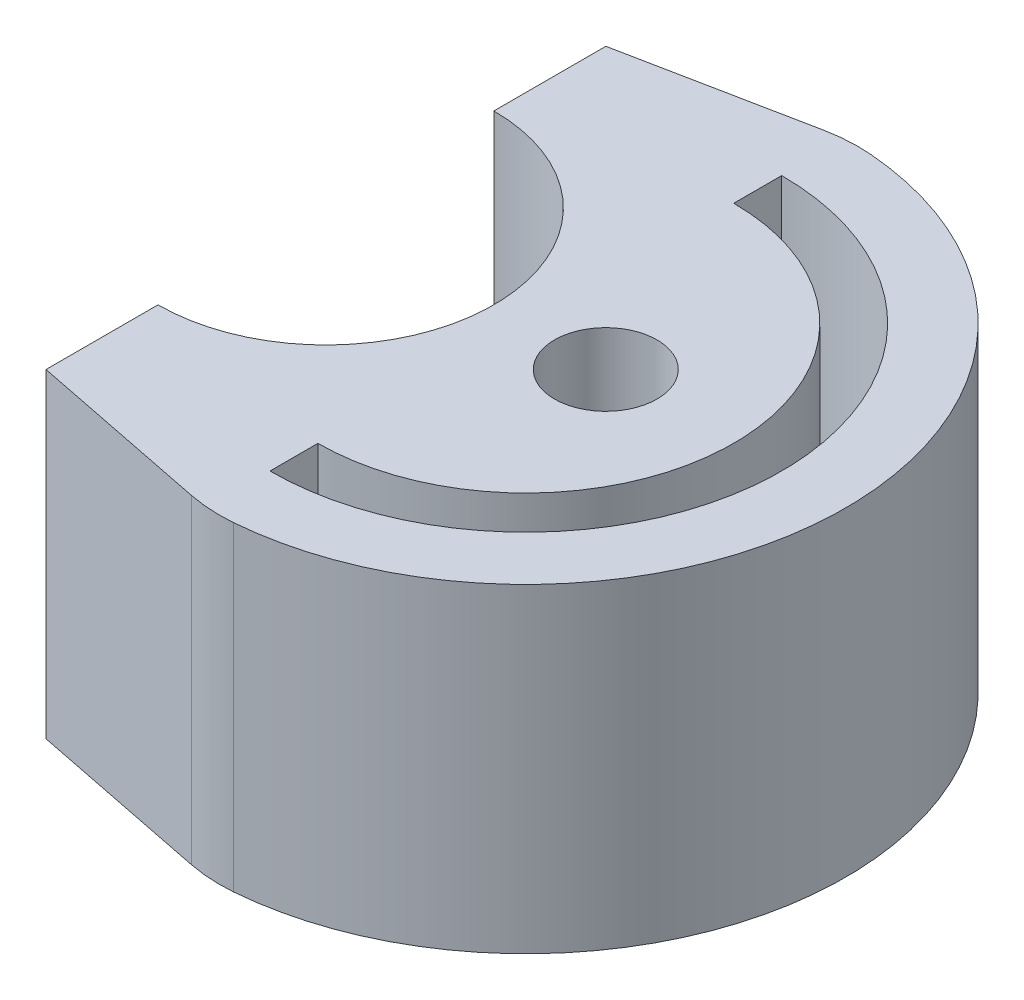
ISO-10303-21;
HEADER;
FILE_DESCRIPTION(('STEP AP214'),'2;1');
FILE_NAME('part.step','',(''),(''),'','','');
FILE_SCHEMA(('AUTOMOTIVE_DESIGN { 1 0 10303 214 1 1 1 1 }'));
ENDSEC;
DATA;
#1=APPLICATION_CONTEXT('core data for automotive mechanical design processes');
#2=APPLICATION_PROTOCOL_DEFINITION('international standard','automotive_design',2000,#1);
#3=PRODUCT_CONTEXT('',#1,'mechanical');
#4=PRODUCT('Part','Part','',(#3));
#5=PRODUCT_RELATED_PRODUCT_CATEGORY('part','',(#4));
#6=PRODUCT_DEFINITION_FORMATION('','',#4);
#7=PRODUCT_DEFINITION_CONTEXT('part definition',#1,'design');
#8=PRODUCT_DEFINITION('design','',#6,#7);
#9=PRODUCT_DEFINITION_SHAPE('','',#8);
#10=(LENGTH_UNIT() NAMED_UNIT(*) SI_UNIT(.MILLI.,.METRE.));
#11=(NAMED_UNIT(*) PLANE_ANGLE_UNIT() SI_UNIT($,.RADIAN.));
#12=(NAMED_UNIT(*) SI_UNIT($,.STERADIAN.) SOLID_ANGLE_UNIT());
#13=UNCERTAINTY_MEASURE_WITH_UNIT(LENGTH_MEASURE(1.E-05),#10,'distance_accuracy_value','');
#14=(GEOMETRIC_REPRESENTATION_CONTEXT(3) GLOBAL_UNCERTAINTY_ASSIGNED_CONTEXT((#13)) GLOBAL_UNIT_ASSIGNED_CONTEXT((#10,
#11,#12)) REPRESENTATION_CONTEXT('',''));
#15=CARTESIAN_POINT('',(0.,0.,0.));
#16=DIRECTION('',(0.,0.,1.));
#17=DIRECTION('',(1.,0.,0.));
#18=AXIS2_PLACEMENT_3D('',#15,#16,#17);
#19=CARTESIAN_POINT('',(-1.05819487287301E-11,0.5,-1.28546370596616E-10));
#20=DIRECTION('',(0.,-1.,0.));
#21=DIRECTION('',(0.,0.,-1.));
#22=AXIS2_PLACEMENT_3D('',#19,#20,#21);
#23=CYLINDRICAL_SURFACE('',#22,2.00000000012898);
#24=CARTESIAN_POINT('',(-1.05819487287301E-11,0.,-1.28546370596616E-10));
#25=DIRECTION('',(0.,1.,0.));
#26=DIRECTION('',(0.,0.,1.));
#27=AXIS2_PLACEMENT_3D('',#24,#25,#26);
#28=CIRCLE('',#27,2.00000000012898);
#29=CARTESIAN_POINT('',(0.164100899999999,0.,-1.99325635472312));
#30=VERTEX_POINT('',#29);
#31=CARTESIAN_POINT('',(0.164100898177525,0.,1.99325635461607));
#32=VERTEX_POINT('',#31);
#33=EDGE_CURVE('E118',#30,#32,#28,.F.);
#34=ORIENTED_EDGE('',*,*,#33,.F.);
#35=DIRECTION('',(0.,-1.,0.));
#36=VECTOR('',#35,1.);
#37=CARTESIAN_POINT('',(0.164100899999999,0.5,-1.99325635472312));
#38=LINE('',#37,#36);
#39=CARTESIAN_POINT('',(0.164100899999999,2.,-1.99325635472312));
#40=VERTEX_POINT('',#39);
#41=EDGE_CURVE('E11',#40,#30,#38,.T.);
#42=ORIENTED_EDGE('',*,*,#41,.F.);
#43=CARTESIAN_POINT('',(-1.05819487287301E-11,2.,-1.28546370596616E-10));
#44=DIRECTION('',(0.,1.,0.));
#45=DIRECTION('',(0.,0.,1.));
#46=AXIS2_PLACEMENT_3D('',#43,#44,#45);
#47=CIRCLE('',#46,2.00000000012898);
#48=CARTESIAN_POINT('',(0.164100898177525,2.,1.99325635461607));
#49=VERTEX_POINT('',#48);
#50=EDGE_CURVE('E209',#40,#49,#47,.F.);
#51=ORIENTED_EDGE('',*,*,#50,.T.);
#52=DIRECTION('',(0.,-1.,0.));
#53=VECTOR('',#52,1.);
#54=CARTESIAN_POINT('',(0.164100898177525,0.5,1.99325635461607));
#55=LINE('',#54,#53);
#56=EDGE_CURVE('E109',#49,#32,#55,.T.);
#57=ORIENTED_EDGE('',*,*,#56,.T.);
#58=EDGE_LOOP('',(#34,#42,#51,#57));
#59=FACE_BOUND('',#58,.T.);
#60=ADVANCED_FACE('F36',(#59),#23,.T.);
#61=CARTESIAN_POINT('',(0.0820504499999999,0.5,-0.996628177490106));
#62=DIRECTION('',(0.,-1.,0.));
#63=DIRECTION('',(0.,0.,-1.));
#64=AXIS2_PLACEMENT_3D('',#61,#62,#63);
#65=CYLINDRICAL_SURFACE('',#64,1.);
#66=CARTESIAN_POINT('',(0.0820504499999999,0.,-0.996628177490106));
#67=DIRECTION('',(0.,1.,0.));
#68=DIRECTION('',(0.,0.,1.));
#69=AXIS2_PLACEMENT_3D('',#66,#67,#68);
#70=CIRCLE('',#69,1.);
#71=CARTESIAN_POINT('',(-0.113883759060197,0.,-1.97724522084595));
#72=VERTEX_POINT('',#71);
#73=EDGE_CURVE('E174',#30,#72,#70,.T.);
#74=ORIENTED_EDGE('',*,*,#73,.T.);
#75=DIRECTION('',(0.,-1.,0.));
#76=VECTOR('',#75,1.);
#77=CARTESIAN_POINT('',(-0.113883759060197,0.5,-1.97724522084595));
#78=LINE('',#77,#76);
#79=CARTESIAN_POINT('',(-0.113883759060197,2.,-1.97724522084595));
#80=VERTEX_POINT('',#79);
#81=EDGE_CURVE('E46',#80,#72,#78,.T.);
#82=ORIENTED_EDGE('',*,*,#81,.F.);
#83=CARTESIAN_POINT('',(0.0820504499999999,2.,-0.996628177490106));
#84=DIRECTION('',(0.,1.,0.));
#85=DIRECTION('',(0.,0.,1.));
#86=AXIS2_PLACEMENT_3D('',#83,#84,#85);
#87=CIRCLE('',#86,1.);
#88=EDGE_CURVE('E219',#40,#80,#87,.T.);
#89=ORIENTED_EDGE('',*,*,#88,.F.);
#90=ORIENTED_EDGE('',*,*,#41,.T.);
#91=EDGE_LOOP('',(#74,#82,#89,#90));
#92=FACE_BOUND('',#91,.T.);
#93=ADVANCED_FACE('F294',(#92),#65,.T.);
#94=CARTESIAN_POINT('',(-0.384272849561752,0.5,-1.92321957143991));
#95=DIRECTION('',(0.195934209060197,0.,0.980617043355843));
#96=DIRECTION('',(0.980617043355843,0.,-0.195934209060197));
#97=AXIS2_PLACEMENT_3D('',#94,#95,#96);
#98=PLANE('',#97);
#99=DIRECTION('',(-0.980617043355843,0.,0.195934209060197));
#100=VECTOR('',#99,1.);
#101=CARTESIAN_POINT('',(-0.384272849561752,0.,-1.92321957143991));
#102=LINE('',#101,#100);
#103=CARTESIAN_POINT('',(-1.24999999999968,0.,-1.7502411741825));
#104=VERTEX_POINT('',#103);
#105=EDGE_CURVE('E177',#72,#104,#102,.T.);
#106=ORIENTED_EDGE('',*,*,#105,.T.);
#107=DIRECTION('',(0.,-1.,0.));
#108=VECTOR('',#107,1.);
#109=CARTESIAN_POINT('',(-1.24999999999968,0.5,-1.7502411741825));
#110=LINE('',#109,#108);
#111=CARTESIAN_POINT('',(-1.24999999999968,2.,-1.7502411741825));
#112=VERTEX_POINT('',#111);
#113=EDGE_CURVE('E134',#112,#104,#110,.T.);
#114=ORIENTED_EDGE('',*,*,#113,.F.);
#115=DIRECTION('',(-0.980617043355843,0.,0.195934209060197));
#116=VECTOR('',#115,1.);
#117=CARTESIAN_POINT('',(-0.384272849561752,2.,-1.92321957143991));
#118=LINE('',#117,#116);
#119=EDGE_CURVE('E226',#80,#112,#118,.T.);
#120=ORIENTED_EDGE('',*,*,#119,.F.);
#121=ORIENTED_EDGE('',*,*,#81,.T.);
#122=EDGE_LOOP('',(#106,#114,#120,#121));
#123=FACE_BOUND('',#122,.T.);
#124=ADVANCED_FACE('F199',(#123),#98,.F.);
#125=CARTESIAN_POINT('',(-1.24999999999968,0.5,0.));
#126=DIRECTION('',(-1.,0.,0.));
#127=DIRECTION('',(0.,0.,1.));
#128=AXIS2_PLACEMENT_3D('',#125,#126,#127);
#129=PLANE('',#128);
#130=DIRECTION('',(0.,0.,-1.));
#131=VECTOR('',#130,1.);
#132=CARTESIAN_POINT('',(-1.24999999999968,0.,0.));
#133=LINE('',#132,#131);
#134=CARTESIAN_POINT('',(-1.24999999999968,0.,-1.2499999999997));
#135=VERTEX_POINT('',#134);
#136=EDGE_CURVE('E180',#135,#104,#133,.T.);
#137=ORIENTED_EDGE('',*,*,#136,.F.);
#138=DIRECTION('',(0.,-1.,0.));
#139=VECTOR('',#138,1.);
#140=CARTESIAN_POINT('',(-1.24999999999968,0.5,-1.2499999999997));
#141=LINE('',#140,#139);
#142=CARTESIAN_POINT('',(-1.24999999999968,0.5,-1.2499999999997));
#143=VERTEX_POINT('',#142);
#144=EDGE_CURVE('E136',#143,#135,#141,.T.);
#145=ORIENTED_EDGE('',*,*,#144,.F.);
#146=DIRECTION('',(0.,0.,1.));
#147=VECTOR('',#146,1.);
#148=CARTESIAN_POINT('',(-1.24999999999968,0.5,0.));
#149=LINE('',#148,#147);
#150=CARTESIAN_POINT('',(-1.24999999999968,0.5,-1.0499999999997));
#151=VERTEX_POINT('',#150);
#152=EDGE_CURVE('E54',#143,#151,#149,.T.);
#153=ORIENTED_EDGE('',*,*,#152,.T.);
#154=DIRECTION('',(0.,-1.,0.));
#155=VECTOR('',#154,1.);
#156=CARTESIAN_POINT('',(-1.24999999999968,2.,-1.0499999999997));
#157=LINE('',#156,#155);
#158=CARTESIAN_POINT('',(-1.24999999999968,2.,-1.0499999999997));
#159=VERTEX_POINT('',#158);
#160=EDGE_CURVE('E244',#159,#151,#157,.T.);
#161=ORIENTED_EDGE('',*,*,#160,.F.);
#162=DIRECTION('',(0.,0.,1.));
#163=VECTOR('',#162,1.);
#164=CARTESIAN_POINT('',(-1.24999999999968,2.,0.));
#165=LINE('',#164,#163);
#166=EDGE_CURVE('E195',#112,#159,#165,.T.);
#167=ORIENTED_EDGE('',*,*,#166,.F.);
#168=ORIENTED_EDGE('',*,*,#113,.T.);
#169=EDGE_LOOP('',(#137,#145,#153,#161,#167,#168));
#170=FACE_BOUND('',#169,.T.);
#171=ADVANCED_FACE('F189',(#170),#129,.T.);
#172=CARTESIAN_POINT('',(-1.24999999999968,0.5,0.));
#173=DIRECTION('',(0.,-1.,0.));
#174=DIRECTION('',(0.,0.,-1.));
#175=AXIS2_PLACEMENT_3D('',#172,#173,#174);
#176=CYLINDRICAL_SURFACE('',#175,1.24999999999969);
#177=CARTESIAN_POINT('',(-1.24999999999968,0.,0.));
#178=DIRECTION('',(0.,1.,0.));
#179=DIRECTION('',(0.,0.,1.));
#180=AXIS2_PLACEMENT_3D('',#177,#178,#179);
#181=CIRCLE('',#180,1.24999999999969);
#182=CARTESIAN_POINT('',(-1.24999999999968,0.,1.24999999999969));
#183=VERTEX_POINT('',#182);
#184=EDGE_CURVE('E126',#183,#135,#181,.T.);
#185=ORIENTED_EDGE('',*,*,#184,.F.);
#186=DIRECTION('',(0.,-1.,0.));
#187=VECTOR('',#186,1.);
#188=CARTESIAN_POINT('',(-1.24999999999968,0.5,1.24999999999969));
#189=LINE('',#188,#187);
#190=CARTESIAN_POINT('',(-1.24999999999968,0.5,1.24999999999969));
#191=VERTEX_POINT('',#190);
#192=EDGE_CURVE('E133',#191,#183,#189,.T.);
#193=ORIENTED_EDGE('',*,*,#192,.F.);
#194=CARTESIAN_POINT('',(-1.24999999999968,0.5,0.));
#195=DIRECTION('',(0.,1.,0.));
#196=DIRECTION('',(0.,0.,1.));
#197=AXIS2_PLACEMENT_3D('',#194,#195,#196);
#198=CIRCLE('',#197,1.24999999999969);
#199=EDGE_CURVE('E119',#191,#143,#198,.T.);
#200=ORIENTED_EDGE('',*,*,#199,.T.);
#201=ORIENTED_EDGE('',*,*,#144,.T.);
#202=EDGE_LOOP('',(#185,#193,#200,#201));
#203=FACE_BOUND('',#202,.T.);
#204=ADVANCED_FACE('F187',(#203),#176,.F.);
#205=CARTESIAN_POINT('',(-1.24999999999968,0.5,0.));
#206=DIRECTION('',(1.,0.,0.));
#207=DIRECTION('',(0.,0.,-1.));
#208=AXIS2_PLACEMENT_3D('',#205,#206,#207);
#209=PLANE('',#208);
#210=DIRECTION('',(0.,0.,1.));
#211=VECTOR('',#210,1.);
#212=CARTESIAN_POINT('',(-1.24999999999968,0.,0.));
#213=LINE('',#212,#211);
#214=CARTESIAN_POINT('',(-1.24999999999968,0.,1.7502411741825));
#215=VERTEX_POINT('',#214);
#216=EDGE_CURVE('E124',#183,#215,#213,.T.);
#217=ORIENTED_EDGE('',*,*,#216,.T.);
#218=DIRECTION('',(0.,-1.,0.));
#219=VECTOR('',#218,1.);
#220=CARTESIAN_POINT('',(-1.24999999999968,0.5,1.7502411741825));
#221=LINE('',#220,#219);
#222=CARTESIAN_POINT('',(-1.24999999999968,2.,1.7502411741825));
#223=VERTEX_POINT('',#222);
#224=EDGE_CURVE('E108',#223,#215,#221,.T.);
#225=ORIENTED_EDGE('',*,*,#224,.F.);
#226=DIRECTION('',(0.,0.,-1.));
#227=VECTOR('',#226,1.);
#228=CARTESIAN_POINT('',(-1.24999999999968,2.,0.));
#229=LINE('',#228,#227);
#230=CARTESIAN_POINT('',(-1.24999999999968,2.,1.04999999999969));
#231=VERTEX_POINT('',#230);
#232=EDGE_CURVE('E221',#223,#231,#229,.T.);
#233=ORIENTED_EDGE('',*,*,#232,.T.);
#234=DIRECTION('',(0.,-1.,0.));
#235=VECTOR('',#234,1.);
#236=CARTESIAN_POINT('',(-1.24999999999968,2.,1.04999999999969));
#237=LINE('',#236,#235);
#238=CARTESIAN_POINT('',(-1.24999999999968,0.5,1.04999999999969));
#239=VERTEX_POINT('',#238);
#240=EDGE_CURVE('E161',#231,#239,#237,.T.);
#241=ORIENTED_EDGE('',*,*,#240,.T.);
#242=DIRECTION('',(0.,0.,-1.));
#243=VECTOR('',#242,1.);
#244=CARTESIAN_POINT('',(-1.24999999999968,0.5,0.));
#245=LINE('',#244,#243);
#246=EDGE_CURVE('E154',#191,#239,#245,.T.);
#247=ORIENTED_EDGE('',*,*,#246,.F.);
#248=ORIENTED_EDGE('',*,*,#192,.T.);
#249=EDGE_LOOP('',(#217,#225,#233,#241,#247,#248));
#250=FACE_BOUND('',#249,.T.);
#251=ADVANCED_FACE('F269',(#250),#209,.F.);
#252=CARTESIAN_POINT('',(-0.384272849561752,0.5,1.92321957143991));
#253=DIRECTION('',(-0.195934209060197,0.,0.980617043355843));
#254=DIRECTION('',(0.980617043355843,0.,0.195934209060197));
#255=AXIS2_PLACEMENT_3D('',#252,#253,#254);
#256=PLANE('',#255);
#257=DIRECTION('',(-0.980617043355843,0.,-0.195934209060197));
#258=VECTOR('',#257,1.);
#259=CARTESIAN_POINT('',(-0.384272849561752,0.,1.92321957143991));
#260=LINE('',#259,#258);
#261=CARTESIAN_POINT('',(-0.113883759971435,0.,1.97724522066388));
#262=VERTEX_POINT('',#261);
#263=EDGE_CURVE('E115',#262,#215,#260,.T.);
#264=ORIENTED_EDGE('',*,*,#263,.F.);
#265=DIRECTION('',(0.,-1.,0.));
#266=VECTOR('',#265,1.);
#267=CARTESIAN_POINT('',(-0.113883759971435,0.5,1.97724522066388));
#268=LINE('',#267,#266);
#269=CARTESIAN_POINT('',(-0.113883759971435,2.,1.97724522066388));
#270=VERTEX_POINT('',#269);
#271=EDGE_CURVE('E95',#270,#262,#268,.T.);
#272=ORIENTED_EDGE('',*,*,#271,.F.);
#273=DIRECTION('',(-0.980617043355843,0.,-0.195934209060197));
#274=VECTOR('',#273,1.);
#275=CARTESIAN_POINT('',(-0.384272849561752,2.,1.92321957143991));
#276=LINE('',#275,#274);
#277=EDGE_CURVE('E217',#270,#223,#276,.T.);
#278=ORIENTED_EDGE('',*,*,#277,.T.);
#279=ORIENTED_EDGE('',*,*,#224,.T.);
#280=EDGE_LOOP('',(#264,#272,#278,#279));
#281=FACE_BOUND('',#280,.T.);
#282=ADVANCED_FACE('F121',(#281),#256,.T.);
#283=CARTESIAN_POINT('',(-1.05819487287301E-11,0.5,-1.28546370596616E-10));
#284=DIRECTION('',(0.,-1.,0.));
#285=DIRECTION('',(0.,0.,-1.));
#286=AXIS2_PLACEMENT_3D('',#283,#284,#285);
#287=CYLINDRICAL_SURFACE('',#286,1.3);
#288=CARTESIAN_POINT('',(-1.05819487287301E-11,0.,-1.28546370596616E-10));
#289=DIRECTION('',(0.,1.,0.));
#290=DIRECTION('',(0.,0.,1.));
#291=AXIS2_PLACEMENT_3D('',#288,#289,#290);
#292=CIRCLE('',#291,1.3);
#293=CARTESIAN_POINT('',(-1.0582065822565E-11,0.,-1.30000000012855));
#294=VERTEX_POINT('',#293);
#295=CARTESIAN_POINT('',(-1.0582065822565E-11,0.,1.29999999987145));
#296=VERTEX_POINT('',#295);
#297=EDGE_CURVE('E157',#294,#296,#292,.F.);
#298=ORIENTED_EDGE('',*,*,#297,.F.);
#299=DIRECTION('',(0.,-1.,0.));
#300=VECTOR('',#299,1.);
#301=CARTESIAN_POINT('',(-1.0582065822565E-11,0.5,-1.30000000012855));
#302=LINE('',#301,#300);
#303=CARTESIAN_POINT('',(-1.0582065822565E-11,2.,-1.30000000012855));
#304=VERTEX_POINT('',#303);
#305=EDGE_CURVE('E130',#304,#294,#302,.T.);
#306=ORIENTED_EDGE('',*,*,#305,.F.);
#307=CARTESIAN_POINT('',(-1.05819487287301E-11,2.,-1.28546370596616E-10));
#308=DIRECTION('',(0.,1.,0.));
#309=DIRECTION('',(0.,0.,1.));
#310=AXIS2_PLACEMENT_3D('',#307,#308,#309);
#311=CIRCLE('',#310,1.3);
#312=CARTESIAN_POINT('',(-1.0582065822565E-11,2.,1.29999999987145));
#313=VERTEX_POINT('',#312);
#314=EDGE_CURVE('E229',#304,#313,#311,.F.);
#315=ORIENTED_EDGE('',*,*,#314,.T.);
#316=DIRECTION('',(0.,-1.,0.));
#317=VECTOR('',#316,1.);
#318=CARTESIAN_POINT('',(-1.0582065822565E-11,0.5,1.29999999987145));
#319=LINE('',#318,#317);
#320=EDGE_CURVE('E139',#313,#296,#319,.T.);
#321=ORIENTED_EDGE('',*,*,#320,.T.);
#322=EDGE_LOOP('',(#298,#306,#315,#321));
#323=FACE_BOUND('',#322,.T.);
#324=ADVANCED_FACE('F38',(#323),#287,.T.);
#325=CARTESIAN_POINT('',(-1.05825008262379E-11,0.5,0.));
#326=DIRECTION('',(1.,0.,0.));
#327=DIRECTION('',(0.,0.,-1.));
#328=AXIS2_PLACEMENT_3D('',#325,#326,#327);
#329=PLANE('',#328);
#330=DIRECTION('',(0.,0.,1.));
#331=VECTOR('',#330,1.);
#332=CARTESIAN_POINT('',(-1.05825008262379E-11,0.,0.));
#333=LINE('',#332,#331);
#334=CARTESIAN_POINT('',(-1.05819654371021E-11,0.,-1.60000000012855));
#335=VERTEX_POINT('',#334);
#336=EDGE_CURVE('E160',#335,#294,#333,.T.);
#337=ORIENTED_EDGE('',*,*,#336,.F.);
#338=DIRECTION('',(0.,-1.,0.));
#339=VECTOR('',#338,1.);
#340=CARTESIAN_POINT('',(-1.05819654371021E-11,0.5,-1.60000000012855));
#341=LINE('',#340,#339);
#342=CARTESIAN_POINT('',(-1.05819654371021E-11,2.,-1.60000000012855));
#343=VERTEX_POINT('',#342);
#344=EDGE_CURVE('E143',#343,#335,#341,.T.);
#345=ORIENTED_EDGE('',*,*,#344,.F.);
#346=DIRECTION('',(0.,0.,1.));
#347=VECTOR('',#346,1.);
#348=CARTESIAN_POINT('',(-1.05825008262379E-11,2.,0.));
#349=LINE('',#348,#347);
#350=EDGE_CURVE('E232',#343,#304,#349,.T.);
#351=ORIENTED_EDGE('',*,*,#350,.T.);
#352=ORIENTED_EDGE('',*,*,#305,.T.);
#353=EDGE_LOOP('',(#337,#345,#351,#352));
#354=FACE_BOUND('',#353,.T.);
#355=ADVANCED_FACE('F314',(#354),#329,.T.);
#356=CARTESIAN_POINT('',(-1.05819487287301E-11,0.5,-1.28546370596616E-10));
#357=DIRECTION('',(0.,-1.,0.));
#358=DIRECTION('',(0.,0.,-1.));
#359=AXIS2_PLACEMENT_3D('',#356,#357,#358);
#360=CYLINDRICAL_SURFACE('',#359,1.6);
#361=CARTESIAN_POINT('',(-1.05819487287301E-11,0.,-1.28546370596616E-10));
#362=DIRECTION('',(0.,1.,0.));
#363=DIRECTION('',(0.,0.,1.));
#364=AXIS2_PLACEMENT_3D('',#361,#362,#363);
#365=CIRCLE('',#364,1.6);
#366=CARTESIAN_POINT('',(-1.05819654371021E-11,0.,1.59999999987145));
#367=VERTEX_POINT('',#366);
#368=EDGE_CURVE('E164',#335,#367,#365,.F.);
#369=ORIENTED_EDGE('',*,*,#368,.T.);
#370=DIRECTION('',(0.,-1.,0.));
#371=VECTOR('',#370,1.);
#372=CARTESIAN_POINT('',(-1.05819654371021E-11,0.5,1.59999999987145));
#373=LINE('',#372,#371);
#374=CARTESIAN_POINT('',(-1.05819654371021E-11,2.,1.59999999987145));
#375=VERTEX_POINT('',#374);
#376=EDGE_CURVE('E141',#375,#367,#373,.T.);
#377=ORIENTED_EDGE('',*,*,#376,.F.);
#378=CARTESIAN_POINT('',(-1.05819487287301E-11,2.,-1.28546370596616E-10));
#379=DIRECTION('',(0.,1.,0.));
#380=DIRECTION('',(0.,0.,1.));
#381=AXIS2_PLACEMENT_3D('',#378,#379,#380);
#382=CIRCLE('',#381,1.6);
#383=EDGE_CURVE('E235',#343,#375,#382,.F.);
#384=ORIENTED_EDGE('',*,*,#383,.F.);
#385=ORIENTED_EDGE('',*,*,#344,.T.);
#386=EDGE_LOOP('',(#369,#377,#384,#385));
#387=FACE_BOUND('',#386,.T.);
#388=ADVANCED_FACE('F309',(#387),#360,.F.);
#389=CARTESIAN_POINT('',(0.5,0.5,0.));
#390=DIRECTION('',(0.,-1.,0.));
#391=DIRECTION('',(0.,0.,-1.));
#392=AXIS2_PLACEMENT_3D('',#389,#390,#391);
#393=CYLINDRICAL_SURFACE('',#392,0.3207);
#394=CARTESIAN_POINT('',(0.5,0.,0.));
#395=DIRECTION('',(0.,1.,0.));
#396=DIRECTION('',(0.,0.,1.));
#397=AXIS2_PLACEMENT_3D('',#394,#395,#396);
#398=CIRCLE('',#397,0.3207);
#399=CARTESIAN_POINT('',(0.5,0.,0.3207));
#400=VERTEX_POINT('',#399);
#401=EDGE_CURVE('E170',#400,#400,#398,.T.);
#402=ORIENTED_EDGE('',*,*,#401,.F.);
#403=EDGE_LOOP('',(#402));
#404=FACE_BOUND('',#403,.T.);
#405=CARTESIAN_POINT('',(0.5,2.,0.));
#406=DIRECTION('',(0.,1.,0.));
#407=DIRECTION('',(0.,0.,1.));
#408=AXIS2_PLACEMENT_3D('',#405,#406,#407);
#409=CIRCLE('',#408,0.3207);
#410=CARTESIAN_POINT('',(0.5,2.,0.3207));
#411=VERTEX_POINT('',#410);
#412=EDGE_CURVE('E241',#411,#411,#409,.T.);
#413=ORIENTED_EDGE('',*,*,#412,.T.);
#414=EDGE_LOOP('',(#413));
#415=FACE_BOUND('',#414,.T.);
#416=ADVANCED_FACE('F305',(#404,#415),#393,.F.);
#417=CARTESIAN_POINT('',(-1.05825008262378E-11,0.5,0.));
#418=DIRECTION('',(1.,0.,0.));
#419=DIRECTION('',(0.,0.,-1.));
#420=AXIS2_PLACEMENT_3D('',#417,#418,#419);
#421=PLANE('',#420);
#422=DIRECTION('',(0.,0.,1.));
#423=VECTOR('',#422,1.);
#424=CARTESIAN_POINT('',(-1.05825008262378E-11,0.,0.));
#425=LINE('',#424,#423);
#426=EDGE_CURVE('E167',#296,#367,#425,.T.);
#427=ORIENTED_EDGE('',*,*,#426,.F.);
#428=ORIENTED_EDGE('',*,*,#320,.F.);
#429=DIRECTION('',(0.,0.,1.));
#430=VECTOR('',#429,1.);
#431=CARTESIAN_POINT('',(-1.05825008262378E-11,2.,0.));
#432=LINE('',#431,#430);
#433=EDGE_CURVE('E238',#313,#375,#432,.T.);
#434=ORIENTED_EDGE('',*,*,#433,.T.);
#435=ORIENTED_EDGE('',*,*,#376,.T.);
#436=EDGE_LOOP('',(#427,#428,#434,#435));
#437=FACE_BOUND('',#436,.T.);
#438=ADVANCED_FACE('F308',(#437),#421,.T.);
#439=CARTESIAN_POINT('',(0.0820504490887623,0.5,0.996628177308034));
#440=DIRECTION('',(0.,-1.,0.));
#441=DIRECTION('',(0.,0.,-1.));
#442=AXIS2_PLACEMENT_3D('',#439,#440,#441);
#443=CYLINDRICAL_SURFACE('',#442,1.);
#444=CARTESIAN_POINT('',(0.0820504490887623,0.,0.996628177308034));
#445=DIRECTION('',(0.,1.,0.));
#446=DIRECTION('',(0.,0.,1.));
#447=AXIS2_PLACEMENT_3D('',#444,#445,#446);
#448=CIRCLE('',#447,1.);
#449=EDGE_CURVE('E99',#262,#32,#448,.T.);
#450=ORIENTED_EDGE('',*,*,#449,.T.);
#451=ORIENTED_EDGE('',*,*,#56,.F.);
#452=CARTESIAN_POINT('',(0.0820504490887623,2.,0.996628177308034));
#453=DIRECTION('',(0.,1.,0.));
#454=DIRECTION('',(0.,0.,1.));
#455=AXIS2_PLACEMENT_3D('',#452,#453,#454);
#456=CIRCLE('',#455,1.);
#457=EDGE_CURVE('E103',#270,#49,#456,.T.);
#458=ORIENTED_EDGE('',*,*,#457,.F.);
#459=ORIENTED_EDGE('',*,*,#271,.T.);
#460=EDGE_LOOP('',(#450,#451,#458,#459));
#461=FACE_BOUND('',#460,.T.);
#462=ADVANCED_FACE('F97',(#461),#443,.T.);
#463=CARTESIAN_POINT('',(0.,0.,0.));
#464=DIRECTION('',(0.,1.,0.));
#465=DIRECTION('',(0.,0.,1.));
#466=AXIS2_PLACEMENT_3D('',#463,#464,#465);
#467=PLANE('',#466);
#468=ORIENTED_EDGE('',*,*,#297,.T.);
#469=ORIENTED_EDGE('',*,*,#426,.T.);
#470=ORIENTED_EDGE('',*,*,#368,.F.);
#471=ORIENTED_EDGE('',*,*,#336,.T.);
#472=EDGE_LOOP('',(#468,#469,#470,#471));
#473=FACE_BOUND('',#472,.T.);
#474=ORIENTED_EDGE('',*,*,#401,.T.);
#475=EDGE_LOOP('',(#474));
#476=FACE_BOUND('',#475,.T.);
#477=ORIENTED_EDGE('',*,*,#33,.T.);
#478=ORIENTED_EDGE('',*,*,#449,.F.);
#479=ORIENTED_EDGE('',*,*,#263,.T.);
#480=ORIENTED_EDGE('',*,*,#216,.F.);
#481=ORIENTED_EDGE('',*,*,#184,.T.);
#482=ORIENTED_EDGE('',*,*,#136,.T.);
#483=ORIENTED_EDGE('',*,*,#105,.F.);
#484=ORIENTED_EDGE('',*,*,#73,.F.);
#485=EDGE_LOOP('',(#477,#478,#479,#480,#481,#482,#483,#484));
#486=FACE_BOUND('',#485,.T.);
#487=ADVANCED_FACE('F113',(#473,#476,#486),#467,.F.);
#488=CARTESIAN_POINT('',(-1.24999999999968,2.,0.));
#489=DIRECTION('',(0.,-1.,0.));
#490=DIRECTION('',(0.,0.,-1.));
#491=AXIS2_PLACEMENT_3D('',#488,#489,#490);
#492=CYLINDRICAL_SURFACE('',#491,1.04999999999969);
#493=CARTESIAN_POINT('',(-1.24999999999968,0.5,0.));
#494=DIRECTION('',(0.,1.,0.));
#495=DIRECTION('',(0.,0.,1.));
#496=AXIS2_PLACEMENT_3D('',#493,#494,#495);
#497=CIRCLE('',#496,1.04999999999969);
#498=EDGE_CURVE('E245',#239,#151,#497,.T.);
#499=ORIENTED_EDGE('',*,*,#498,.F.);
#500=ORIENTED_EDGE('',*,*,#240,.F.);
#501=CARTESIAN_POINT('',(-1.24999999999968,2.,0.));
#502=DIRECTION('',(0.,1.,0.));
#503=DIRECTION('',(0.,0.,1.));
#504=AXIS2_PLACEMENT_3D('',#501,#502,#503);
#505=CIRCLE('',#504,1.04999999999969);
#506=EDGE_CURVE('E251',#231,#159,#505,.T.);
#507=ORIENTED_EDGE('',*,*,#506,.T.);
#508=ORIENTED_EDGE('',*,*,#160,.T.);
#509=EDGE_LOOP('',(#499,#500,#507,#508));
#510=FACE_BOUND('',#509,.T.);
#511=ADVANCED_FACE('F263',(#510),#492,.F.);
#512=CARTESIAN_POINT('',(0.,2.,0.));
#513=DIRECTION('',(0.,1.,0.));
#514=DIRECTION('',(0.,0.,1.));
#515=AXIS2_PLACEMENT_3D('',#512,#513,#514);
#516=PLANE('',#515);
#517=ORIENTED_EDGE('',*,*,#506,.F.);
#518=ORIENTED_EDGE('',*,*,#232,.F.);
#519=ORIENTED_EDGE('',*,*,#277,.F.);
#520=ORIENTED_EDGE('',*,*,#457,.T.);
#521=ORIENTED_EDGE('',*,*,#50,.F.);
#522=ORIENTED_EDGE('',*,*,#88,.T.);
#523=ORIENTED_EDGE('',*,*,#119,.T.);
#524=ORIENTED_EDGE('',*,*,#166,.T.);
#525=EDGE_LOOP('',(#517,#518,#519,#520,#521,#522,#523,#524));
#526=FACE_BOUND('',#525,.T.);
#527=ORIENTED_EDGE('',*,*,#314,.F.);
#528=ORIENTED_EDGE('',*,*,#350,.F.);
#529=ORIENTED_EDGE('',*,*,#383,.T.);
#530=ORIENTED_EDGE('',*,*,#433,.F.);
#531=EDGE_LOOP('',(#527,#528,#529,#530));
#532=FACE_BOUND('',#531,.T.);
#533=ORIENTED_EDGE('',*,*,#412,.F.);
#534=EDGE_LOOP('',(#533));
#535=FACE_BOUND('',#534,.T.);
#536=ADVANCED_FACE('F213',(#526,#532,#535),#516,.T.);
#537=CARTESIAN_POINT('',(0.,0.5,0.));
#538=DIRECTION('',(0.,1.,0.));
#539=DIRECTION('',(0.,0.,1.));
#540=AXIS2_PLACEMENT_3D('',#537,#538,#539);
#541=PLANE('',#540);
#542=ORIENTED_EDGE('',*,*,#199,.F.);
#543=ORIENTED_EDGE('',*,*,#246,.T.);
#544=ORIENTED_EDGE('',*,*,#498,.T.);
#545=ORIENTED_EDGE('',*,*,#152,.F.);
#546=EDGE_LOOP('',(#542,#543,#544,#545));
#547=FACE_BOUND('',#546,.T.);
#548=ADVANCED_FACE('F267',(#547),#541,.F.);
#549=CLOSED_SHELL('',(#60,#93,#124,#171,#204,#251,#282,#324,#355,#388,#416,#438,#462,#487,#511,
#536,#548));
#550=MANIFOLD_SOLID_BREP('B2',#549);
#551=ADVANCED_BREP_SHAPE_REPRESENTATION('',(#18,#550),#14);
#552=SHAPE_DEFINITION_REPRESENTATION(#9,#551);
ENDSEC;
END-ISO-10303-21;
